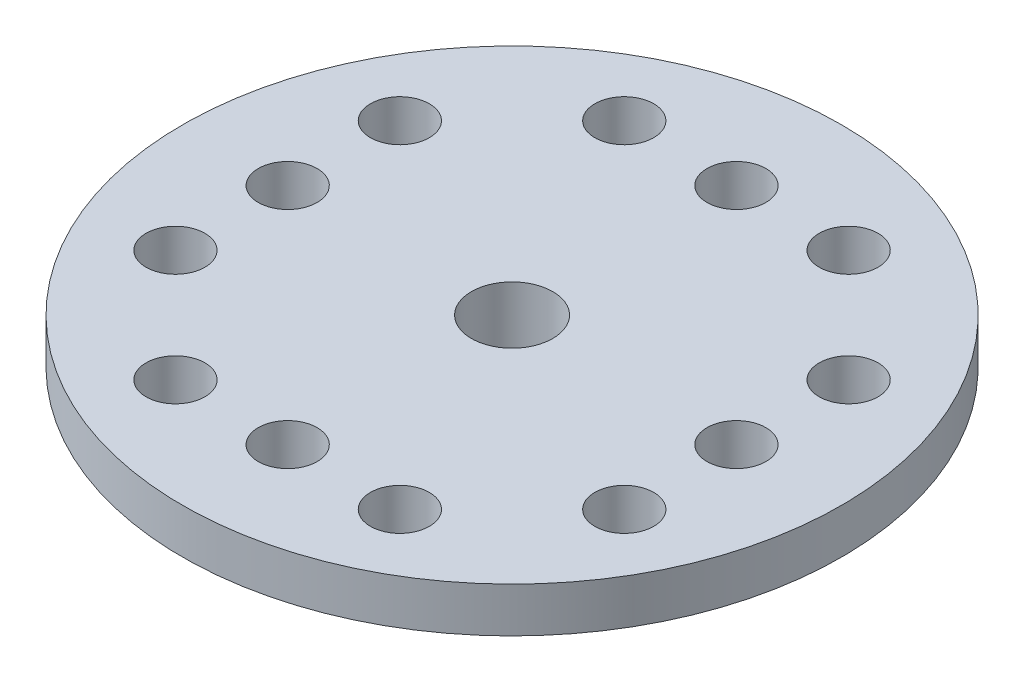
ISO-10303-21;
HEADER;
FILE_DESCRIPTION(('STEP AP214'),'2;1');
FILE_NAME('part.step','',(''),(''),'','','');
FILE_SCHEMA(('AUTOMOTIVE_DESIGN { 1 0 10303 214 1 1 1 1 }'));
ENDSEC;
DATA;
#1=APPLICATION_CONTEXT('core data for automotive mechanical design processes');
#2=APPLICATION_PROTOCOL_DEFINITION('international standard','automotive_design',2000,#1);
#3=PRODUCT_CONTEXT('',#1,'mechanical');
#4=PRODUCT('Part','Part','',(#3));
#5=PRODUCT_RELATED_PRODUCT_CATEGORY('part','',(#4));
#6=PRODUCT_DEFINITION_FORMATION('','',#4);
#7=PRODUCT_DEFINITION_CONTEXT('part definition',#1,'design');
#8=PRODUCT_DEFINITION('design','',#6,#7);
#9=PRODUCT_DEFINITION_SHAPE('','',#8);
#10=(LENGTH_UNIT() NAMED_UNIT(*) SI_UNIT(.MILLI.,.METRE.));
#11=(NAMED_UNIT(*) PLANE_ANGLE_UNIT() SI_UNIT($,.RADIAN.));
#12=(NAMED_UNIT(*) SI_UNIT($,.STERADIAN.) SOLID_ANGLE_UNIT());
#13=UNCERTAINTY_MEASURE_WITH_UNIT(LENGTH_MEASURE(1.E-05),#10,'distance_accuracy_value','');
#14=(GEOMETRIC_REPRESENTATION_CONTEXT(3) GLOBAL_UNCERTAINTY_ASSIGNED_CONTEXT((#13)) GLOBAL_UNIT_ASSIGNED_CONTEXT((#10,
#11,#12)) REPRESENTATION_CONTEXT('',''));
#15=CARTESIAN_POINT('',(0.,0.,0.));
#16=DIRECTION('',(0.,0.,1.));
#17=DIRECTION('',(1.,0.,0.));
#18=AXIS2_PLACEMENT_3D('',#15,#16,#17);
#19=CARTESIAN_POINT('',(0.,-4.,0.));
#20=DIRECTION('',(0.,-1.,0.));
#21=DIRECTION('',(0.,0.,-1.));
#22=AXIS2_PLACEMENT_3D('',#19,#20,#21);
#23=CYLINDRICAL_SURFACE('',#22,2.75);
#24=CARTESIAN_POINT('',(0.,-7.5,0.));
#25=DIRECTION('',(0.,-1.,0.));
#26=DIRECTION('',(0.,0.,-1.));
#27=AXIS2_PLACEMENT_3D('',#24,#25,#26);
#28=CIRCLE('',#27,2.75);
#29=CARTESIAN_POINT('',(0.,-7.5,-2.75));
#30=VERTEX_POINT('',#29);
#31=EDGE_CURVE('E117',#30,#30,#28,.F.);
#32=ORIENTED_EDGE('',*,*,#31,.F.);
#33=EDGE_LOOP('',(#32));
#34=FACE_BOUND('',#33,.T.);
#35=CARTESIAN_POINT('',(0.,-4.,0.));
#36=DIRECTION('',(0.,-1.,0.));
#37=DIRECTION('',(0.,0.,-1.));
#38=AXIS2_PLACEMENT_3D('',#35,#36,#37);
#39=CIRCLE('',#38,2.75);
#40=CARTESIAN_POINT('',(0.,-4.,-2.75));
#41=VERTEX_POINT('',#40);
#42=EDGE_CURVE('E17',#41,#41,#39,.T.);
#43=ORIENTED_EDGE('',*,*,#42,.F.);
#44=EDGE_LOOP('',(#43));
#45=FACE_BOUND('',#44,.T.);
#46=ADVANCED_FACE('F14',(#34,#45),#23,.F.);
#47=CARTESIAN_POINT('',(0.,-4.,0.));
#48=DIRECTION('',(0.,-1.,0.));
#49=DIRECTION('',(0.,0.,-1.));
#50=AXIS2_PLACEMENT_3D('',#47,#48,#49);
#51=PLANE('',#50);
#52=CARTESIAN_POINT('',(0.,-4.,0.));
#53=DIRECTION('',(0.,1.,0.));
#54=DIRECTION('',(0.,0.,1.));
#55=AXIS2_PLACEMENT_3D('',#52,#53,#54);
#56=CIRCLE('',#55,1.6);
#57=CARTESIAN_POINT('',(0.,-4.,1.6));
#58=VERTEX_POINT('',#57);
#59=EDGE_CURVE('E115',#58,#58,#56,.T.);
#60=ORIENTED_EDGE('',*,*,#59,.T.);
#61=EDGE_LOOP('',(#60));
#62=FACE_BOUND('',#61,.T.);
#63=ORIENTED_EDGE('',*,*,#42,.T.);
#64=EDGE_LOOP('',(#63));
#65=FACE_BOUND('',#64,.T.);
#66=ADVANCED_FACE('F124',(#62,#65),#51,.T.);
#67=CARTESIAN_POINT('',(0.,-7.5,0.));
#68=DIRECTION('',(0.,-1.,0.));
#69=DIRECTION('',(0.,0.,-1.));
#70=AXIS2_PLACEMENT_3D('',#67,#68,#69);
#71=PLANE('',#70);
#72=CARTESIAN_POINT('',(0.,-7.5,0.));
#73=DIRECTION('',(0.,1.,0.));
#74=DIRECTION('',(0.,0.,1.));
#75=AXIS2_PLACEMENT_3D('',#72,#73,#74);
#76=CIRCLE('',#75,5.09);
#77=CARTESIAN_POINT('',(0.,-7.5,5.09));
#78=VERTEX_POINT('',#77);
#79=EDGE_CURVE('E112',#78,#78,#76,.T.);
#80=ORIENTED_EDGE('',*,*,#79,.F.);
#81=EDGE_LOOP('',(#80));
#82=FACE_BOUND('',#81,.T.);
#83=ORIENTED_EDGE('',*,*,#31,.T.);
#84=EDGE_LOOP('',(#83));
#85=FACE_BOUND('',#84,.T.);
#86=ADVANCED_FACE('F132',(#82,#85),#71,.T.);
#87=CARTESIAN_POINT('',(0.,-12.0254833995939,0.));
#88=DIRECTION('',(0.,1.,0.));
#89=DIRECTION('',(0.,0.,1.));
#90=AXIS2_PLACEMENT_3D('',#87,#88,#89);
#91=CYLINDRICAL_SURFACE('',#90,1.6);
#92=CARTESIAN_POINT('',(0.,-2.8,0.));
#93=DIRECTION('',(0.,1.,0.));
#94=DIRECTION('',(0.,0.,1.));
#95=AXIS2_PLACEMENT_3D('',#92,#93,#94);
#96=CIRCLE('',#95,1.6);
#97=CARTESIAN_POINT('',(0.,-2.8,1.6));
#98=VERTEX_POINT('',#97);
#99=EDGE_CURVE('E109',#98,#98,#96,.F.);
#100=ORIENTED_EDGE('',*,*,#99,.F.);
#101=EDGE_LOOP('',(#100));
#102=FACE_BOUND('',#101,.T.);
#103=ORIENTED_EDGE('',*,*,#59,.F.);
#104=EDGE_LOOP('',(#103));
#105=FACE_BOUND('',#104,.T.);
#106=ADVANCED_FACE('F208',(#102,#105),#91,.F.);
#107=CARTESIAN_POINT('',(0.,-7.5,0.));
#108=DIRECTION('',(0.,1.,0.));
#109=DIRECTION('',(0.,0.,1.));
#110=AXIS2_PLACEMENT_3D('',#107,#108,#109);
#111=CYLINDRICAL_SURFACE('',#110,5.09);
#112=ORIENTED_EDGE('',*,*,#79,.T.);
#113=EDGE_LOOP('',(#112));
#114=FACE_BOUND('',#113,.T.);
#115=CARTESIAN_POINT('',(0.,0.,0.));
#116=DIRECTION('',(0.,1.,0.));
#117=DIRECTION('',(0.,0.,1.));
#118=AXIS2_PLACEMENT_3D('',#115,#116,#117);
#119=CIRCLE('',#118,5.09);
#120=CARTESIAN_POINT('',(0.,0.,5.09));
#121=VERTEX_POINT('',#120);
#122=EDGE_CURVE('E106',#121,#121,#119,.F.);
#123=ORIENTED_EDGE('',*,*,#122,.T.);
#124=EDGE_LOOP('',(#123));
#125=FACE_BOUND('',#124,.T.);
#126=ADVANCED_FACE('F204',(#114,#125),#111,.T.);
#127=CARTESIAN_POINT('',(0.,-2.8,0.));
#128=DIRECTION('',(0.,1.,0.));
#129=DIRECTION('',(0.,0.,1.));
#130=AXIS2_PLACEMENT_3D('',#127,#128,#129);
#131=PLANE('',#130);
#132=CARTESIAN_POINT('',(0.,-2.8,0.));
#133=DIRECTION('',(0.,-1.,0.));
#134=DIRECTION('',(0.,0.,-1.));
#135=AXIS2_PLACEMENT_3D('',#132,#133,#134);
#136=CIRCLE('',#135,2.9);
#137=CARTESIAN_POINT('',(0.,-2.8,-2.9));
#138=VERTEX_POINT('',#137);
#139=EDGE_CURVE('E82',#138,#138,#136,.F.);
#140=ORIENTED_EDGE('',*,*,#139,.T.);
#141=EDGE_LOOP('',(#140));
#142=FACE_BOUND('',#141,.T.);
#143=ORIENTED_EDGE('',*,*,#99,.T.);
#144=EDGE_LOOP('',(#143));
#145=FACE_BOUND('',#144,.T.);
#146=ADVANCED_FACE('F200',(#142,#145),#131,.T.);
#147=CARTESIAN_POINT('',(0.,0.,0.));
#148=DIRECTION('',(0.,1.,0.));
#149=DIRECTION('',(0.,0.,1.));
#150=AXIS2_PLACEMENT_3D('',#147,#148,#149);
#151=PLANE('',#150);
#152=CARTESIAN_POINT('',(16.0000000000002,0.,8.));
#153=DIRECTION('',(0.,-1.,0.));
#154=DIRECTION('',(0.,0.,-1.));
#155=AXIS2_PLACEMENT_3D('',#152,#153,#154);
#156=CIRCLE('',#155,2.1);
#157=CARTESIAN_POINT('',(16.0000000000002,0.,5.9));
#158=VERTEX_POINT('',#157);
#159=EDGE_CURVE('E64',#158,#158,#156,.F.);
#160=ORIENTED_EDGE('',*,*,#159,.T.);
#161=EDGE_LOOP('',(#160));
#162=FACE_BOUND('',#161,.T.);
#163=CARTESIAN_POINT('',(16.0000000000001,0.,0.));
#164=DIRECTION('',(0.,-1.,0.));
#165=DIRECTION('',(0.,0.,-1.));
#166=AXIS2_PLACEMENT_3D('',#163,#164,#165);
#167=CIRCLE('',#166,2.1);
#168=CARTESIAN_POINT('',(16.0000000000001,0.,-2.1));
#169=VERTEX_POINT('',#168);
#170=EDGE_CURVE('E103',#169,#169,#167,.F.);
#171=ORIENTED_EDGE('',*,*,#170,.T.);
#172=EDGE_LOOP('',(#171));
#173=FACE_BOUND('',#172,.T.);
#174=CARTESIAN_POINT('',(16.,0.,-8.));
#175=DIRECTION('',(0.,-1.,0.));
#176=DIRECTION('',(0.,0.,-1.));
#177=AXIS2_PLACEMENT_3D('',#174,#175,#176);
#178=CIRCLE('',#177,2.1);
#179=CARTESIAN_POINT('',(16.,0.,-10.1));
#180=VERTEX_POINT('',#179);
#181=EDGE_CURVE('E67',#180,#180,#178,.F.);
#182=ORIENTED_EDGE('',*,*,#181,.T.);
#183=EDGE_LOOP('',(#182));
#184=FACE_BOUND('',#183,.T.);
#185=CARTESIAN_POINT('',(-7.99999999999972,0.,16.0000000000002));
#186=DIRECTION('',(0.,-1.,0.));
#187=DIRECTION('',(0.,0.,-1.));
#188=AXIS2_PLACEMENT_3D('',#185,#186,#187);
#189=CIRCLE('',#188,2.1);
#190=CARTESIAN_POINT('',(-7.99999999999972,0.,13.9000000000002));
#191=VERTEX_POINT('',#190);
#192=EDGE_CURVE('E100',#191,#191,#189,.F.);
#193=ORIENTED_EDGE('',*,*,#192,.T.);
#194=EDGE_LOOP('',(#193));
#195=FACE_BOUND('',#194,.T.);
#196=CARTESIAN_POINT('',(2.81025203108243E-13,0.,16.0000000000001));
#197=DIRECTION('',(0.,-1.,0.));
#198=DIRECTION('',(0.,0.,-1.));
#199=AXIS2_PLACEMENT_3D('',#196,#197,#198);
#200=CIRCLE('',#199,2.1);
#201=CARTESIAN_POINT('',(2.81025203108243E-13,0.,13.9000000000001));
#202=VERTEX_POINT('',#201);
#203=EDGE_CURVE('E70',#202,#202,#200,.F.);
#204=ORIENTED_EDGE('',*,*,#203,.T.);
#205=EDGE_LOOP('',(#204));
#206=FACE_BOUND('',#205,.T.);
#207=CARTESIAN_POINT('',(8.00000000000028,0.,16.0000000000001));
#208=DIRECTION('',(0.,-1.,0.));
#209=DIRECTION('',(0.,0.,-1.));
#210=AXIS2_PLACEMENT_3D('',#207,#208,#209);
#211=CIRCLE('',#210,2.1);
#212=CARTESIAN_POINT('',(8.00000000000028,0.,13.9000000000001));
#213=VERTEX_POINT('',#212);
#214=EDGE_CURVE('E97',#213,#213,#211,.F.);
#215=ORIENTED_EDGE('',*,*,#214,.T.);
#216=EDGE_LOOP('',(#215));
#217=FACE_BOUND('',#216,.T.);
#218=CARTESIAN_POINT('',(-15.9999999999998,0.,8.00000000000022));
#219=DIRECTION('',(0.,-1.,0.));
#220=DIRECTION('',(0.,0.,-1.));
#221=AXIS2_PLACEMENT_3D('',#218,#219,#220);
#222=CIRCLE('',#221,2.1);
#223=CARTESIAN_POINT('',(-15.9999999999998,0.,5.90000000000022));
#224=VERTEX_POINT('',#223);
#225=EDGE_CURVE('E73',#224,#224,#222,.F.);
#226=ORIENTED_EDGE('',*,*,#225,.T.);
#227=EDGE_LOOP('',(#226));
#228=FACE_BOUND('',#227,.T.);
#229=CARTESIAN_POINT('',(-15.9999999999999,0.,2.22044604925031E-13));
#230=DIRECTION('',(0.,-1.,0.));
#231=DIRECTION('',(0.,0.,-1.));
#232=AXIS2_PLACEMENT_3D('',#229,#230,#231);
#233=CIRCLE('',#232,2.1);
#234=CARTESIAN_POINT('',(-15.9999999999999,0.,-2.09999999999978));
#235=VERTEX_POINT('',#234);
#236=EDGE_CURVE('E94',#235,#235,#233,.F.);
#237=ORIENTED_EDGE('',*,*,#236,.T.);
#238=EDGE_LOOP('',(#237));
#239=FACE_BOUND('',#238,.T.);
#240=CARTESIAN_POINT('',(-16.,0.,-7.99999999999978));
#241=DIRECTION('',(0.,-1.,0.));
#242=DIRECTION('',(0.,0.,-1.));
#243=AXIS2_PLACEMENT_3D('',#240,#241,#242);
#244=CIRCLE('',#243,2.1);
#245=CARTESIAN_POINT('',(-16.,0.,-10.0999999999998));
#246=VERTEX_POINT('',#245);
#247=EDGE_CURVE('E76',#246,#246,#244,.F.);
#248=ORIENTED_EDGE('',*,*,#247,.T.);
#249=EDGE_LOOP('',(#248));
#250=FACE_BOUND('',#249,.T.);
#251=CARTESIAN_POINT('',(-8.00000000000006,0.,-15.9999999999998));
#252=DIRECTION('',(0.,-1.,0.));
#253=DIRECTION('',(0.,0.,-1.));
#254=AXIS2_PLACEMENT_3D('',#251,#252,#253);
#255=CIRCLE('',#254,2.1);
#256=CARTESIAN_POINT('',(-8.00000000000006,0.,-18.0999999999998));
#257=VERTEX_POINT('',#256);
#258=EDGE_CURVE('E91',#257,#257,#255,.F.);
#259=ORIENTED_EDGE('',*,*,#258,.T.);
#260=EDGE_LOOP('',(#259));
#261=FACE_BOUND('',#260,.T.);
#262=CARTESIAN_POINT('',(0.,0.,-15.9999999999999));
#263=DIRECTION('',(0.,-1.,0.));
#264=DIRECTION('',(0.,0.,-1.));
#265=AXIS2_PLACEMENT_3D('',#262,#263,#264);
#266=CIRCLE('',#265,2.1);
#267=CARTESIAN_POINT('',(0.,0.,-18.0999999999999));
#268=VERTEX_POINT('',#267);
#269=EDGE_CURVE('E79',#268,#268,#266,.F.);
#270=ORIENTED_EDGE('',*,*,#269,.T.);
#271=EDGE_LOOP('',(#270));
#272=FACE_BOUND('',#271,.T.);
#273=CARTESIAN_POINT('',(7.99999999999994,0.,-15.9999999999999));
#274=DIRECTION('',(0.,-1.,0.));
#275=DIRECTION('',(0.,0.,-1.));
#276=AXIS2_PLACEMENT_3D('',#273,#274,#275);
#277=CIRCLE('',#276,2.1);
#278=CARTESIAN_POINT('',(7.99999999999994,0.,-18.0999999999999));
#279=VERTEX_POINT('',#278);
#280=EDGE_CURVE('E88',#279,#279,#277,.F.);
#281=ORIENTED_EDGE('',*,*,#280,.T.);
#282=EDGE_LOOP('',(#281));
#283=FACE_BOUND('',#282,.T.);
#284=CARTESIAN_POINT('',(0.,0.,0.));
#285=DIRECTION('',(0.,-1.,0.));
#286=DIRECTION('',(0.,0.,-1.));
#287=AXIS2_PLACEMENT_3D('',#284,#285,#286);
#288=CIRCLE('',#287,23.5);
#289=CARTESIAN_POINT('',(0.,0.,-23.5));
#290=VERTEX_POINT('',#289);
#291=EDGE_CURVE('E85',#290,#290,#288,.F.);
#292=ORIENTED_EDGE('',*,*,#291,.F.);
#293=EDGE_LOOP('',(#292));
#294=FACE_BOUND('',#293,.T.);
#295=ORIENTED_EDGE('',*,*,#122,.F.);
#296=EDGE_LOOP('',(#295));
#297=FACE_BOUND('',#296,.T.);
#298=ADVANCED_FACE('F196',(#162,#173,#184,#195,#206,#217,#228,#239,#250,#261,#272,#283,#294,
#297),#151,.F.);
#299=CARTESIAN_POINT('',(16.0000000000001,3.2,0.));
#300=DIRECTION('',(0.,-1.,0.));
#301=DIRECTION('',(0.,0.,-1.));
#302=AXIS2_PLACEMENT_3D('',#299,#300,#301);
#303=CYLINDRICAL_SURFACE('',#302,2.1);
#304=CARTESIAN_POINT('',(16.0000000000001,3.2,0.));
#305=DIRECTION('',(0.,-1.,0.));
#306=DIRECTION('',(0.,0.,-1.));
#307=AXIS2_PLACEMENT_3D('',#304,#305,#306);
#308=CIRCLE('',#307,2.1);
#309=CARTESIAN_POINT('',(16.0000000000001,3.2,-2.1));
#310=VERTEX_POINT('',#309);
#311=EDGE_CURVE('E61',#310,#310,#308,.T.);
#312=ORIENTED_EDGE('',*,*,#311,.F.);
#313=EDGE_LOOP('',(#312));
#314=FACE_BOUND('',#313,.T.);
#315=ORIENTED_EDGE('',*,*,#170,.F.);
#316=EDGE_LOOP('',(#315));
#317=FACE_BOUND('',#316,.T.);
#318=ADVANCED_FACE('F192',(#314,#317),#303,.F.);
#319=CARTESIAN_POINT('',(-7.99999999999972,3.2,16.0000000000002));
#320=DIRECTION('',(0.,-1.,0.));
#321=DIRECTION('',(0.,0.,-1.));
#322=AXIS2_PLACEMENT_3D('',#319,#320,#321);
#323=CYLINDRICAL_SURFACE('',#322,2.1);
#324=CARTESIAN_POINT('',(-7.99999999999972,3.2,16.0000000000002));
#325=DIRECTION('',(0.,-1.,0.));
#326=DIRECTION('',(0.,0.,-1.));
#327=AXIS2_PLACEMENT_3D('',#324,#325,#326);
#328=CIRCLE('',#327,2.1);
#329=CARTESIAN_POINT('',(-7.99999999999972,3.2,13.9000000000002));
#330=VERTEX_POINT('',#329);
#331=EDGE_CURVE('E58',#330,#330,#328,.T.);
#332=ORIENTED_EDGE('',*,*,#331,.F.);
#333=EDGE_LOOP('',(#332));
#334=FACE_BOUND('',#333,.T.);
#335=ORIENTED_EDGE('',*,*,#192,.F.);
#336=EDGE_LOOP('',(#335));
#337=FACE_BOUND('',#336,.T.);
#338=ADVANCED_FACE('F188',(#334,#337),#323,.F.);
#339=CARTESIAN_POINT('',(8.00000000000028,3.2,16.0000000000001));
#340=DIRECTION('',(0.,-1.,0.));
#341=DIRECTION('',(0.,0.,-1.));
#342=AXIS2_PLACEMENT_3D('',#339,#340,#341);
#343=CYLINDRICAL_SURFACE('',#342,2.1);
#344=CARTESIAN_POINT('',(8.00000000000028,3.2,16.0000000000001));
#345=DIRECTION('',(0.,-1.,0.));
#346=DIRECTION('',(0.,0.,-1.));
#347=AXIS2_PLACEMENT_3D('',#344,#345,#346);
#348=CIRCLE('',#347,2.1);
#349=CARTESIAN_POINT('',(8.00000000000028,3.2,13.9000000000001));
#350=VERTEX_POINT('',#349);
#351=EDGE_CURVE('E55',#350,#350,#348,.T.);
#352=ORIENTED_EDGE('',*,*,#351,.F.);
#353=EDGE_LOOP('',(#352));
#354=FACE_BOUND('',#353,.T.);
#355=ORIENTED_EDGE('',*,*,#214,.F.);
#356=EDGE_LOOP('',(#355));
#357=FACE_BOUND('',#356,.T.);
#358=ADVANCED_FACE('F184',(#354,#357),#343,.F.);
#359=CARTESIAN_POINT('',(-15.9999999999999,3.2,2.22044604925031E-13));
#360=DIRECTION('',(0.,-1.,0.));
#361=DIRECTION('',(0.,0.,-1.));
#362=AXIS2_PLACEMENT_3D('',#359,#360,#361);
#363=CYLINDRICAL_SURFACE('',#362,2.1);
#364=CARTESIAN_POINT('',(-15.9999999999999,3.2,2.22044604925031E-13));
#365=DIRECTION('',(0.,-1.,0.));
#366=DIRECTION('',(0.,0.,-1.));
#367=AXIS2_PLACEMENT_3D('',#364,#365,#366);
#368=CIRCLE('',#367,2.1);
#369=CARTESIAN_POINT('',(-15.9999999999999,3.2,-2.09999999999978));
#370=VERTEX_POINT('',#369);
#371=EDGE_CURVE('E52',#370,#370,#368,.T.);
#372=ORIENTED_EDGE('',*,*,#371,.F.);
#373=EDGE_LOOP('',(#372));
#374=FACE_BOUND('',#373,.T.);
#375=ORIENTED_EDGE('',*,*,#236,.F.);
#376=EDGE_LOOP('',(#375));
#377=FACE_BOUND('',#376,.T.);
#378=ADVANCED_FACE('F180',(#374,#377),#363,.F.);
#379=CARTESIAN_POINT('',(-8.00000000000006,3.2,-15.9999999999998));
#380=DIRECTION('',(0.,-1.,0.));
#381=DIRECTION('',(0.,0.,-1.));
#382=AXIS2_PLACEMENT_3D('',#379,#380,#381);
#383=CYLINDRICAL_SURFACE('',#382,2.1);
#384=CARTESIAN_POINT('',(-8.00000000000006,3.2,-15.9999999999998));
#385=DIRECTION('',(0.,-1.,0.));
#386=DIRECTION('',(0.,0.,-1.));
#387=AXIS2_PLACEMENT_3D('',#384,#385,#386);
#388=CIRCLE('',#387,2.1);
#389=CARTESIAN_POINT('',(-8.00000000000006,3.2,-18.0999999999998));
#390=VERTEX_POINT('',#389);
#391=EDGE_CURVE('E49',#390,#390,#388,.T.);
#392=ORIENTED_EDGE('',*,*,#391,.F.);
#393=EDGE_LOOP('',(#392));
#394=FACE_BOUND('',#393,.T.);
#395=ORIENTED_EDGE('',*,*,#258,.F.);
#396=EDGE_LOOP('',(#395));
#397=FACE_BOUND('',#396,.T.);
#398=ADVANCED_FACE('F176',(#394,#397),#383,.F.);
#399=CARTESIAN_POINT('',(7.99999999999994,3.2,-15.9999999999999));
#400=DIRECTION('',(0.,-1.,0.));
#401=DIRECTION('',(0.,0.,-1.));
#402=AXIS2_PLACEMENT_3D('',#399,#400,#401);
#403=CYLINDRICAL_SURFACE('',#402,2.1);
#404=CARTESIAN_POINT('',(7.99999999999994,3.2,-15.9999999999999));
#405=DIRECTION('',(0.,-1.,0.));
#406=DIRECTION('',(0.,0.,-1.));
#407=AXIS2_PLACEMENT_3D('',#404,#405,#406);
#408=CIRCLE('',#407,2.1);
#409=CARTESIAN_POINT('',(7.99999999999994,3.2,-18.0999999999999));
#410=VERTEX_POINT('',#409);
#411=EDGE_CURVE('E46',#410,#410,#408,.T.);
#412=ORIENTED_EDGE('',*,*,#411,.F.);
#413=EDGE_LOOP('',(#412));
#414=FACE_BOUND('',#413,.T.);
#415=ORIENTED_EDGE('',*,*,#280,.F.);
#416=EDGE_LOOP('',(#415));
#417=FACE_BOUND('',#416,.T.);
#418=ADVANCED_FACE('F172',(#414,#417),#403,.F.);
#419=CARTESIAN_POINT('',(0.,3.2,0.));
#420=DIRECTION('',(0.,-1.,0.));
#421=DIRECTION('',(0.,0.,-1.));
#422=AXIS2_PLACEMENT_3D('',#419,#420,#421);
#423=CYLINDRICAL_SURFACE('',#422,23.5);
#424=ORIENTED_EDGE('',*,*,#291,.T.);
#425=EDGE_LOOP('',(#424));
#426=FACE_BOUND('',#425,.T.);
#427=CARTESIAN_POINT('',(0.,3.2,0.));
#428=DIRECTION('',(0.,-1.,0.));
#429=DIRECTION('',(0.,0.,-1.));
#430=AXIS2_PLACEMENT_3D('',#427,#428,#429);
#431=CIRCLE('',#430,23.5);
#432=CARTESIAN_POINT('',(0.,3.2,-23.5));
#433=VERTEX_POINT('',#432);
#434=EDGE_CURVE('E43',#433,#433,#431,.F.);
#435=ORIENTED_EDGE('',*,*,#434,.F.);
#436=EDGE_LOOP('',(#435));
#437=FACE_BOUND('',#436,.T.);
#438=ADVANCED_FACE('F168',(#426,#437),#423,.T.);
#439=CARTESIAN_POINT('',(0.,3.2,0.));
#440=DIRECTION('',(0.,-1.,0.));
#441=DIRECTION('',(0.,0.,-1.));
#442=AXIS2_PLACEMENT_3D('',#439,#440,#441);
#443=CYLINDRICAL_SURFACE('',#442,2.9);
#444=CARTESIAN_POINT('',(0.,3.2,0.));
#445=DIRECTION('',(0.,-1.,0.));
#446=DIRECTION('',(0.,0.,-1.));
#447=AXIS2_PLACEMENT_3D('',#444,#445,#446);
#448=CIRCLE('',#447,2.9);
#449=CARTESIAN_POINT('',(0.,3.2,-2.9));
#450=VERTEX_POINT('',#449);
#451=EDGE_CURVE('E40',#450,#450,#448,.T.);
#452=ORIENTED_EDGE('',*,*,#451,.F.);
#453=EDGE_LOOP('',(#452));
#454=FACE_BOUND('',#453,.T.);
#455=ORIENTED_EDGE('',*,*,#139,.F.);
#456=EDGE_LOOP('',(#455));
#457=FACE_BOUND('',#456,.T.);
#458=ADVANCED_FACE('F164',(#454,#457),#443,.F.);
#459=CARTESIAN_POINT('',(0.,3.2,-15.9999999999999));
#460=DIRECTION('',(0.,-1.,0.));
#461=DIRECTION('',(0.,0.,-1.));
#462=AXIS2_PLACEMENT_3D('',#459,#460,#461);
#463=CYLINDRICAL_SURFACE('',#462,2.1);
#464=CARTESIAN_POINT('',(0.,3.2,-15.9999999999999));
#465=DIRECTION('',(0.,-1.,0.));
#466=DIRECTION('',(0.,0.,-1.));
#467=AXIS2_PLACEMENT_3D('',#464,#465,#466);
#468=CIRCLE('',#467,2.1);
#469=CARTESIAN_POINT('',(0.,3.2,-18.0999999999999));
#470=VERTEX_POINT('',#469);
#471=EDGE_CURVE('E37',#470,#470,#468,.T.);
#472=ORIENTED_EDGE('',*,*,#471,.F.);
#473=EDGE_LOOP('',(#472));
#474=FACE_BOUND('',#473,.T.);
#475=ORIENTED_EDGE('',*,*,#269,.F.);
#476=EDGE_LOOP('',(#475));
#477=FACE_BOUND('',#476,.T.);
#478=ADVANCED_FACE('F160',(#474,#477),#463,.F.);
#479=CARTESIAN_POINT('',(-16.,3.2,-7.99999999999978));
#480=DIRECTION('',(0.,-1.,0.));
#481=DIRECTION('',(0.,0.,-1.));
#482=AXIS2_PLACEMENT_3D('',#479,#480,#481);
#483=CYLINDRICAL_SURFACE('',#482,2.1);
#484=CARTESIAN_POINT('',(-16.,3.2,-7.99999999999978));
#485=DIRECTION('',(0.,-1.,0.));
#486=DIRECTION('',(0.,0.,-1.));
#487=AXIS2_PLACEMENT_3D('',#484,#485,#486);
#488=CIRCLE('',#487,2.1);
#489=CARTESIAN_POINT('',(-16.,3.2,-10.0999999999998));
#490=VERTEX_POINT('',#489);
#491=EDGE_CURVE('E34',#490,#490,#488,.T.);
#492=ORIENTED_EDGE('',*,*,#491,.F.);
#493=EDGE_LOOP('',(#492));
#494=FACE_BOUND('',#493,.T.);
#495=ORIENTED_EDGE('',*,*,#247,.F.);
#496=EDGE_LOOP('',(#495));
#497=FACE_BOUND('',#496,.T.);
#498=ADVANCED_FACE('F156',(#494,#497),#483,.F.);
#499=CARTESIAN_POINT('',(-15.9999999999998,3.2,8.00000000000022));
#500=DIRECTION('',(0.,-1.,0.));
#501=DIRECTION('',(0.,0.,-1.));
#502=AXIS2_PLACEMENT_3D('',#499,#500,#501);
#503=CYLINDRICAL_SURFACE('',#502,2.1);
#504=CARTESIAN_POINT('',(-15.9999999999998,3.2,8.00000000000022));
#505=DIRECTION('',(0.,-1.,0.));
#506=DIRECTION('',(0.,0.,-1.));
#507=AXIS2_PLACEMENT_3D('',#504,#505,#506);
#508=CIRCLE('',#507,2.1);
#509=CARTESIAN_POINT('',(-15.9999999999998,3.2,5.90000000000022));
#510=VERTEX_POINT('',#509);
#511=EDGE_CURVE('E31',#510,#510,#508,.T.);
#512=ORIENTED_EDGE('',*,*,#511,.F.);
#513=EDGE_LOOP('',(#512));
#514=FACE_BOUND('',#513,.T.);
#515=ORIENTED_EDGE('',*,*,#225,.F.);
#516=EDGE_LOOP('',(#515));
#517=FACE_BOUND('',#516,.T.);
#518=ADVANCED_FACE('F152',(#514,#517),#503,.F.);
#519=CARTESIAN_POINT('',(2.81025203108243E-13,3.2,16.0000000000001));
#520=DIRECTION('',(0.,-1.,0.));
#521=DIRECTION('',(0.,0.,-1.));
#522=AXIS2_PLACEMENT_3D('',#519,#520,#521);
#523=CYLINDRICAL_SURFACE('',#522,2.1);
#524=CARTESIAN_POINT('',(2.81025203108243E-13,3.2,16.0000000000001));
#525=DIRECTION('',(0.,-1.,0.));
#526=DIRECTION('',(0.,0.,-1.));
#527=AXIS2_PLACEMENT_3D('',#524,#525,#526);
#528=CIRCLE('',#527,2.1);
#529=CARTESIAN_POINT('',(2.81025203108243E-13,3.2,13.9000000000001));
#530=VERTEX_POINT('',#529);
#531=EDGE_CURVE('E26',#530,#530,#528,.T.);
#532=ORIENTED_EDGE('',*,*,#531,.F.);
#533=EDGE_LOOP('',(#532));
#534=FACE_BOUND('',#533,.T.);
#535=ORIENTED_EDGE('',*,*,#203,.F.);
#536=EDGE_LOOP('',(#535));
#537=FACE_BOUND('',#536,.T.);
#538=ADVANCED_FACE('F148',(#534,#537),#523,.F.);
#539=CARTESIAN_POINT('',(16.,3.2,-8.));
#540=DIRECTION('',(0.,-1.,0.));
#541=DIRECTION('',(0.,0.,-1.));
#542=AXIS2_PLACEMENT_3D('',#539,#540,#541);
#543=CYLINDRICAL_SURFACE('',#542,2.1);
#544=CARTESIAN_POINT('',(16.,3.2,-8.));
#545=DIRECTION('',(0.,-1.,0.));
#546=DIRECTION('',(0.,0.,-1.));
#547=AXIS2_PLACEMENT_3D('',#544,#545,#546);
#548=CIRCLE('',#547,2.1);
#549=CARTESIAN_POINT('',(16.,3.2,-10.1));
#550=VERTEX_POINT('',#549);
#551=EDGE_CURVE('E21',#550,#550,#548,.T.);
#552=ORIENTED_EDGE('',*,*,#551,.F.);
#553=EDGE_LOOP('',(#552));
#554=FACE_BOUND('',#553,.T.);
#555=ORIENTED_EDGE('',*,*,#181,.F.);
#556=EDGE_LOOP('',(#555));
#557=FACE_BOUND('',#556,.T.);
#558=ADVANCED_FACE('F141',(#554,#557),#543,.F.);
#559=CARTESIAN_POINT('',(16.0000000000002,3.2,8.));
#560=DIRECTION('',(0.,-1.,0.));
#561=DIRECTION('',(0.,0.,-1.));
#562=AXIS2_PLACEMENT_3D('',#559,#560,#561);
#563=CYLINDRICAL_SURFACE('',#562,2.1);
#564=CARTESIAN_POINT('',(16.0000000000002,3.2,8.));
#565=DIRECTION('',(0.,-1.,0.));
#566=DIRECTION('',(0.,0.,-1.));
#567=AXIS2_PLACEMENT_3D('',#564,#565,#566);
#568=CIRCLE('',#567,2.1);
#569=CARTESIAN_POINT('',(16.0000000000002,3.2,5.9));
#570=VERTEX_POINT('',#569);
#571=EDGE_CURVE('E10',#570,#570,#568,.T.);
#572=ORIENTED_EDGE('',*,*,#571,.F.);
#573=EDGE_LOOP('',(#572));
#574=FACE_BOUND('',#573,.T.);
#575=ORIENTED_EDGE('',*,*,#159,.F.);
#576=EDGE_LOOP('',(#575));
#577=FACE_BOUND('',#576,.T.);
#578=ADVANCED_FACE('F136',(#574,#577),#563,.F.);
#579=CARTESIAN_POINT('',(0.,3.2,0.));
#580=DIRECTION('',(0.,1.,0.));
#581=DIRECTION('',(0.,0.,1.));
#582=AXIS2_PLACEMENT_3D('',#579,#580,#581);
#583=PLANE('',#582);
#584=ORIENTED_EDGE('',*,*,#571,.T.);
#585=EDGE_LOOP('',(#584));
#586=FACE_BOUND('',#585,.T.);
#587=ORIENTED_EDGE('',*,*,#551,.T.);
#588=EDGE_LOOP('',(#587));
#589=FACE_BOUND('',#588,.T.);
#590=ORIENTED_EDGE('',*,*,#531,.T.);
#591=EDGE_LOOP('',(#590));
#592=FACE_BOUND('',#591,.T.);
#593=ORIENTED_EDGE('',*,*,#511,.T.);
#594=EDGE_LOOP('',(#593));
#595=FACE_BOUND('',#594,.T.);
#596=ORIENTED_EDGE('',*,*,#491,.T.);
#597=EDGE_LOOP('',(#596));
#598=FACE_BOUND('',#597,.T.);
#599=ORIENTED_EDGE('',*,*,#471,.T.);
#600=EDGE_LOOP('',(#599));
#601=FACE_BOUND('',#600,.T.);
#602=ORIENTED_EDGE('',*,*,#451,.T.);
#603=EDGE_LOOP('',(#602));
#604=FACE_BOUND('',#603,.T.);
#605=ORIENTED_EDGE('',*,*,#434,.T.);
#606=EDGE_LOOP('',(#605));
#607=FACE_BOUND('',#606,.T.);
#608=ORIENTED_EDGE('',*,*,#411,.T.);
#609=EDGE_LOOP('',(#608));
#610=FACE_BOUND('',#609,.T.);
#611=ORIENTED_EDGE('',*,*,#391,.T.);
#612=EDGE_LOOP('',(#611));
#613=FACE_BOUND('',#612,.T.);
#614=ORIENTED_EDGE('',*,*,#371,.T.);
#615=EDGE_LOOP('',(#614));
#616=FACE_BOUND('',#615,.T.);
#617=ORIENTED_EDGE('',*,*,#351,.T.);
#618=EDGE_LOOP('',(#617));
#619=FACE_BOUND('',#618,.T.);
#620=ORIENTED_EDGE('',*,*,#331,.T.);
#621=EDGE_LOOP('',(#620));
#622=FACE_BOUND('',#621,.T.);
#623=ORIENTED_EDGE('',*,*,#311,.T.);
#624=EDGE_LOOP('',(#623));
#625=FACE_BOUND('',#624,.T.);
#626=ADVANCED_FACE('F134',(#586,#589,#592,#595,#598,#601,#604,#607,#610,#613,#616,#619,#622,
#625),#583,.T.);
#627=CLOSED_SHELL('',(#46,#66,#86,#106,#126,#146,#298,#318,#338,#358,#378,#398,#418,#438,#458,
#478,#498,#518,#538,#558,#578,#626));
#628=MANIFOLD_SOLID_BREP('B1',#627);
#629=ADVANCED_BREP_SHAPE_REPRESENTATION('',(#18,#628),#14);
#630=SHAPE_DEFINITION_REPRESENTATION(#9,#629);
ENDSEC;
END-ISO-10303-21;
